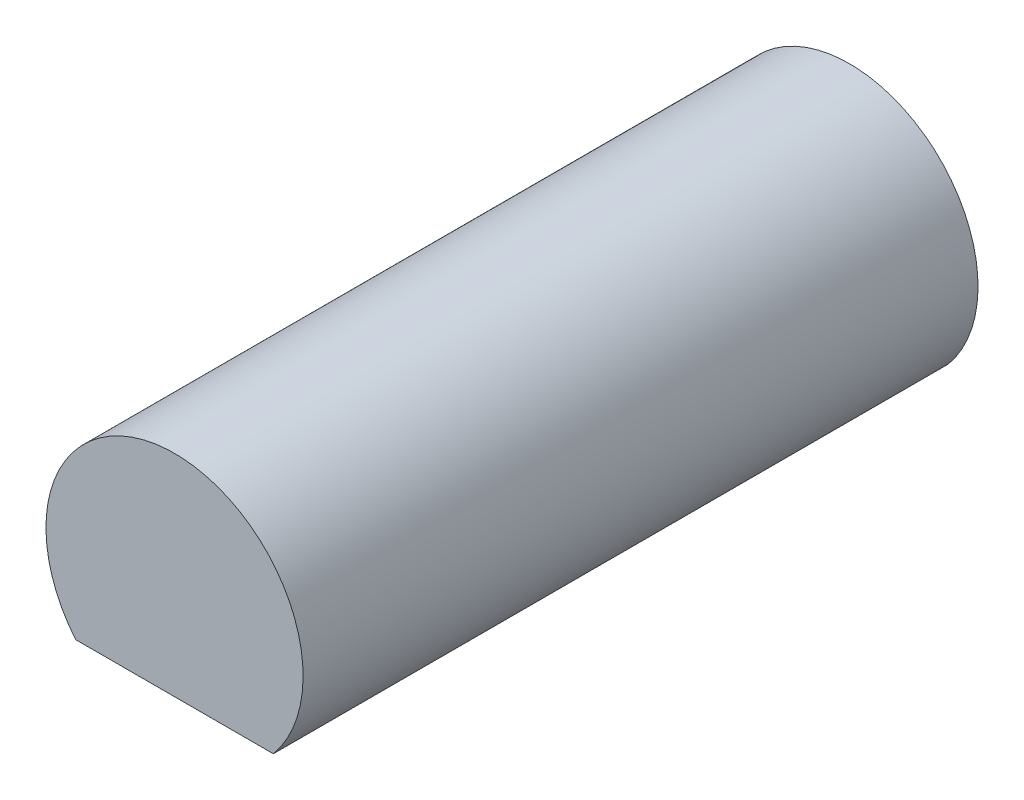
ISO-10303-21;
HEADER;
FILE_DESCRIPTION(('STEP AP214'),'2;1');
FILE_NAME('part.step','',(''),(''),'','','');
FILE_SCHEMA(('AUTOMOTIVE_DESIGN { 1 0 10303 214 1 1 1 1 }'));
ENDSEC;
DATA;
#1=APPLICATION_CONTEXT('core data for automotive mechanical design processes');
#2=APPLICATION_PROTOCOL_DEFINITION('international standard','automotive_design',2000,#1);
#3=PRODUCT_CONTEXT('',#1,'mechanical');
#4=PRODUCT('Part','Part','',(#3));
#5=PRODUCT_RELATED_PRODUCT_CATEGORY('part','',(#4));
#6=PRODUCT_DEFINITION_FORMATION('','',#4);
#7=PRODUCT_DEFINITION_CONTEXT('part definition',#1,'design');
#8=PRODUCT_DEFINITION('design','',#6,#7);
#9=PRODUCT_DEFINITION_SHAPE('','',#8);
#10=(LENGTH_UNIT() NAMED_UNIT(*) SI_UNIT(.MILLI.,.METRE.));
#11=(NAMED_UNIT(*) PLANE_ANGLE_UNIT() SI_UNIT($,.RADIAN.));
#12=(NAMED_UNIT(*) SI_UNIT($,.STERADIAN.) SOLID_ANGLE_UNIT());
#13=UNCERTAINTY_MEASURE_WITH_UNIT(LENGTH_MEASURE(1.E-05),#10,'distance_accuracy_value','');
#14=(GEOMETRIC_REPRESENTATION_CONTEXT(3) GLOBAL_UNCERTAINTY_ASSIGNED_CONTEXT((#13)) GLOBAL_UNIT_ASSIGNED_CONTEXT((#10,
#11,#12)) REPRESENTATION_CONTEXT('',''));
#15=CARTESIAN_POINT('',(0.,0.,0.));
#16=DIRECTION('',(0.,0.,1.));
#17=DIRECTION('',(1.,0.,0.));
#18=AXIS2_PLACEMENT_3D('',#15,#16,#17);
#19=CARTESIAN_POINT('',(0.,0.,10.5));
#20=DIRECTION('',(0.,0.,-1.));
#21=DIRECTION('',(-1.,0.,0.));
#22=AXIS2_PLACEMENT_3D('',#19,#20,#21);
#23=CYLINDRICAL_SURFACE('',#22,4.);
#24=CARTESIAN_POINT('',(0.,0.,-10.5));
#25=DIRECTION('',(0.,0.,1.));
#26=DIRECTION('',(1.,0.,0.));
#27=AXIS2_PLACEMENT_3D('',#24,#25,#26);
#28=CIRCLE('',#27,4.);
#29=CARTESIAN_POINT('',(3.075,-2.55819760769179,-10.5));
#30=VERTEX_POINT('',#29);
#31=CARTESIAN_POINT('',(-3.075,-2.55819760769179,-10.5));
#32=VERTEX_POINT('',#31);
#33=EDGE_CURVE('E63',#30,#32,#28,.T.);
#34=ORIENTED_EDGE('',*,*,#33,.T.);
#35=DIRECTION('',(0.,0.,-1.));
#36=VECTOR('',#35,1.);
#37=CARTESIAN_POINT('',(-3.075,-2.55819760769179,10.5));
#38=LINE('',#37,#36);
#39=CARTESIAN_POINT('',(-3.075,-2.55819760769179,10.5));
#40=VERTEX_POINT('',#39);
#41=EDGE_CURVE('E11',#40,#32,#38,.T.);
#42=ORIENTED_EDGE('',*,*,#41,.F.);
#43=CARTESIAN_POINT('',(0.,0.,10.5));
#44=DIRECTION('',(0.,0.,1.));
#45=DIRECTION('',(1.,0.,0.));
#46=AXIS2_PLACEMENT_3D('',#43,#44,#45);
#47=CIRCLE('',#46,4.);
#48=CARTESIAN_POINT('',(3.075,-2.55819760769179,10.5));
#49=VERTEX_POINT('',#48);
#50=EDGE_CURVE('E62',#49,#40,#47,.T.);
#51=ORIENTED_EDGE('',*,*,#50,.F.);
#52=DIRECTION('',(0.,0.,-1.));
#53=VECTOR('',#52,1.);
#54=CARTESIAN_POINT('',(3.075,-2.55819760769179,10.5));
#55=LINE('',#54,#53);
#56=EDGE_CURVE('E40',#49,#30,#55,.T.);
#57=ORIENTED_EDGE('',*,*,#56,.T.);
#58=EDGE_LOOP('',(#34,#42,#51,#57));
#59=FACE_BOUND('',#58,.T.);
#60=ADVANCED_FACE('F32',(#59),#23,.T.);
#61=CARTESIAN_POINT('',(3.075,-2.55819760769179,10.5));
#62=DIRECTION('',(0.,1.,0.));
#63=DIRECTION('',(0.,0.,1.));
#64=AXIS2_PLACEMENT_3D('',#61,#62,#63);
#65=PLANE('',#64);
#66=DIRECTION('',(1.,0.,0.));
#67=VECTOR('',#66,1.);
#68=CARTESIAN_POINT('',(3.075,-2.55819760769179,-10.5));
#69=LINE('',#68,#67);
#70=EDGE_CURVE('E55',#32,#30,#69,.T.);
#71=ORIENTED_EDGE('',*,*,#70,.T.);
#72=ORIENTED_EDGE('',*,*,#56,.F.);
#73=DIRECTION('',(1.,0.,0.));
#74=VECTOR('',#73,1.);
#75=CARTESIAN_POINT('',(3.075,-2.55819760769179,10.5));
#76=LINE('',#75,#74);
#77=EDGE_CURVE('E47',#40,#49,#76,.T.);
#78=ORIENTED_EDGE('',*,*,#77,.F.);
#79=ORIENTED_EDGE('',*,*,#41,.T.);
#80=EDGE_LOOP('',(#71,#72,#78,#79));
#81=FACE_BOUND('',#80,.T.);
#82=ADVANCED_FACE('F58',(#81),#65,.F.);
#83=CARTESIAN_POINT('',(0.,0.,10.5));
#84=DIRECTION('',(0.,0.,1.));
#85=DIRECTION('',(1.,0.,0.));
#86=AXIS2_PLACEMENT_3D('',#83,#84,#85);
#87=PLANE('',#86);
#88=ORIENTED_EDGE('',*,*,#50,.T.);
#89=ORIENTED_EDGE('',*,*,#77,.T.);
#90=EDGE_LOOP('',(#88,#89));
#91=FACE_BOUND('',#90,.T.);
#92=ADVANCED_FACE('F70',(#91),#87,.T.);
#93=CARTESIAN_POINT('',(0.,0.,-10.5));
#94=DIRECTION('',(0.,0.,1.));
#95=DIRECTION('',(1.,0.,0.));
#96=AXIS2_PLACEMENT_3D('',#93,#94,#95);
#97=PLANE('',#96);
#98=ORIENTED_EDGE('',*,*,#33,.F.);
#99=ORIENTED_EDGE('',*,*,#70,.F.);
#100=EDGE_LOOP('',(#98,#99));
#101=FACE_BOUND('',#100,.T.);
#102=ADVANCED_FACE('F66',(#101),#97,.F.);
#103=CLOSED_SHELL('',(#60,#82,#92,#102));
#104=MANIFOLD_SOLID_BREP('B2',#103);
#105=ADVANCED_BREP_SHAPE_REPRESENTATION('',(#18,#104),#14);
#106=SHAPE_DEFINITION_REPRESENTATION(#9,#105);
ENDSEC;
END-ISO-10303-21;
